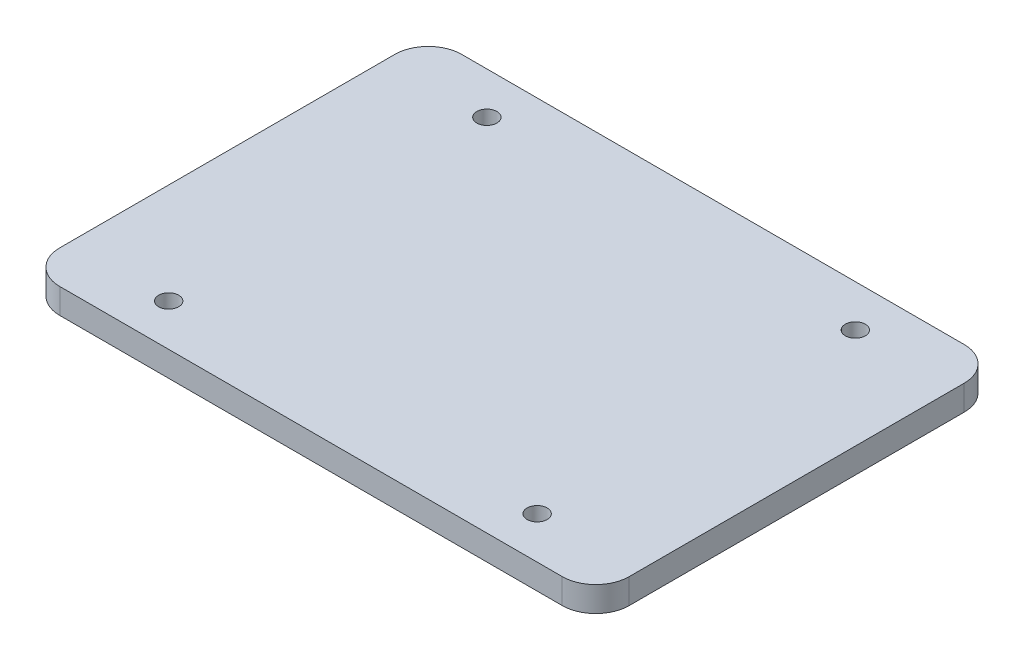
ISO-10303-21;
HEADER;
FILE_DESCRIPTION(('STEP AP214'),'2;1');
FILE_NAME('part.step','',(''),(''),'','','');
FILE_SCHEMA(('AUTOMOTIVE_DESIGN { 1 0 10303 214 1 1 1 1 }'));
ENDSEC;
DATA;
#1=APPLICATION_CONTEXT('core data for automotive mechanical design processes');
#2=APPLICATION_PROTOCOL_DEFINITION('international standard','automotive_design',2000,#1);
#3=PRODUCT_CONTEXT('',#1,'mechanical');
#4=PRODUCT('Part','Part','',(#3));
#5=PRODUCT_RELATED_PRODUCT_CATEGORY('part','',(#4));
#6=PRODUCT_DEFINITION_FORMATION('','',#4);
#7=PRODUCT_DEFINITION_CONTEXT('part definition',#1,'design');
#8=PRODUCT_DEFINITION('design','',#6,#7);
#9=PRODUCT_DEFINITION_SHAPE('','',#8);
#10=(LENGTH_UNIT() NAMED_UNIT(*) SI_UNIT(.MILLI.,.METRE.));
#11=(NAMED_UNIT(*) PLANE_ANGLE_UNIT() SI_UNIT($,.RADIAN.));
#12=(NAMED_UNIT(*) SI_UNIT($,.STERADIAN.) SOLID_ANGLE_UNIT());
#13=UNCERTAINTY_MEASURE_WITH_UNIT(LENGTH_MEASURE(1.E-05),#10,'distance_accuracy_value','');
#14=(GEOMETRIC_REPRESENTATION_CONTEXT(3) GLOBAL_UNCERTAINTY_ASSIGNED_CONTEXT((#13)) GLOBAL_UNIT_ASSIGNED_CONTEXT((#10,
#11,#12)) REPRESENTATION_CONTEXT('',''));
#15=CARTESIAN_POINT('',(0.,0.,0.));
#16=DIRECTION('',(0.,0.,1.));
#17=DIRECTION('',(1.,0.,0.));
#18=AXIS2_PLACEMENT_3D('',#15,#16,#17);
#19=CARTESIAN_POINT('',(-150.,15.,-100.));
#20=DIRECTION('',(0.,-1.,0.));
#21=DIRECTION('',(0.,0.,-1.));
#22=AXIS2_PLACEMENT_3D('',#19,#20,#21);
#23=CYLINDRICAL_SURFACE('',#22,20.);
#24=CARTESIAN_POINT('',(-150.,0.,-100.));
#25=DIRECTION('',(0.,-1.,0.));
#26=DIRECTION('',(0.,0.,-1.));
#27=AXIS2_PLACEMENT_3D('',#24,#25,#26);
#28=CIRCLE('',#27,20.);
#29=CARTESIAN_POINT('',(-170.,0.,-100.));
#30=VERTEX_POINT('',#29);
#31=CARTESIAN_POINT('',(-150.,0.,-120.));
#32=VERTEX_POINT('',#31);
#33=EDGE_CURVE('E142',#30,#32,#28,.T.);
#34=ORIENTED_EDGE('',*,*,#33,.F.);
#35=DIRECTION('',(0.,-1.,0.));
#36=VECTOR('',#35,1.);
#37=CARTESIAN_POINT('',(-170.,15.,-100.));
#38=LINE('',#37,#36);
#39=CARTESIAN_POINT('',(-170.,15.,-100.));
#40=VERTEX_POINT('',#39);
#41=EDGE_CURVE('E11',#40,#30,#38,.T.);
#42=ORIENTED_EDGE('',*,*,#41,.F.);
#43=CARTESIAN_POINT('',(-150.,15.,-100.));
#44=DIRECTION('',(0.,-1.,0.));
#45=DIRECTION('',(0.,0.,-1.));
#46=AXIS2_PLACEMENT_3D('',#43,#44,#45);
#47=CIRCLE('',#46,20.);
#48=CARTESIAN_POINT('',(-150.,15.,-120.));
#49=VERTEX_POINT('',#48);
#50=EDGE_CURVE('E162',#40,#49,#47,.T.);
#51=ORIENTED_EDGE('',*,*,#50,.T.);
#52=DIRECTION('',(0.,-1.,0.));
#53=VECTOR('',#52,1.);
#54=CARTESIAN_POINT('',(-150.,15.,-120.));
#55=LINE('',#54,#53);
#56=EDGE_CURVE('E50',#49,#32,#55,.T.);
#57=ORIENTED_EDGE('',*,*,#56,.T.);
#58=EDGE_LOOP('',(#34,#42,#51,#57));
#59=FACE_BOUND('',#58,.T.);
#60=ADVANCED_FACE('F47',(#59),#23,.T.);
#61=CARTESIAN_POINT('',(-170.,15.,-100.));
#62=DIRECTION('',(1.,0.,0.));
#63=DIRECTION('',(0.,0.,-1.));
#64=AXIS2_PLACEMENT_3D('',#61,#62,#63);
#65=PLANE('',#64);
#66=DIRECTION('',(0.,0.,1.));
#67=VECTOR('',#66,1.);
#68=CARTESIAN_POINT('',(-170.,0.,-100.));
#69=LINE('',#68,#67);
#70=CARTESIAN_POINT('',(-170.,0.,99.9999999999999));
#71=VERTEX_POINT('',#70);
#72=EDGE_CURVE('E161',#30,#71,#69,.T.);
#73=ORIENTED_EDGE('',*,*,#72,.T.);
#74=DIRECTION('',(0.,-1.,0.));
#75=VECTOR('',#74,1.);
#76=CARTESIAN_POINT('',(-170.,15.,99.9999999999999));
#77=LINE('',#76,#75);
#78=CARTESIAN_POINT('',(-170.,15.,99.9999999999999));
#79=VERTEX_POINT('',#78);
#80=EDGE_CURVE('E56',#79,#71,#77,.T.);
#81=ORIENTED_EDGE('',*,*,#80,.F.);
#82=DIRECTION('',(0.,0.,1.));
#83=VECTOR('',#82,1.);
#84=CARTESIAN_POINT('',(-170.,15.,-100.));
#85=LINE('',#84,#83);
#86=EDGE_CURVE('E137',#40,#79,#85,.T.);
#87=ORIENTED_EDGE('',*,*,#86,.F.);
#88=ORIENTED_EDGE('',*,*,#41,.T.);
#89=EDGE_LOOP('',(#73,#81,#87,#88));
#90=FACE_BOUND('',#89,.T.);
#91=ADVANCED_FACE('F175',(#90),#65,.F.);
#92=CARTESIAN_POINT('',(-150.,15.,100.));
#93=DIRECTION('',(0.,-1.,0.));
#94=DIRECTION('',(0.,0.,-1.));
#95=AXIS2_PLACEMENT_3D('',#92,#93,#94);
#96=CYLINDRICAL_SURFACE('',#95,20.);
#97=CARTESIAN_POINT('',(-150.,0.,100.));
#98=DIRECTION('',(0.,-1.,0.));
#99=DIRECTION('',(0.,0.,-1.));
#100=AXIS2_PLACEMENT_3D('',#97,#98,#99);
#101=CIRCLE('',#100,20.);
#102=CARTESIAN_POINT('',(-150.,0.,120.));
#103=VERTEX_POINT('',#102);
#104=EDGE_CURVE('E122',#103,#71,#101,.T.);
#105=ORIENTED_EDGE('',*,*,#104,.F.);
#106=DIRECTION('',(0.,-1.,0.));
#107=VECTOR('',#106,1.);
#108=CARTESIAN_POINT('',(-150.,15.,120.));
#109=LINE('',#108,#107);
#110=CARTESIAN_POINT('',(-150.,15.,120.));
#111=VERTEX_POINT('',#110);
#112=EDGE_CURVE('E116',#111,#103,#109,.T.);
#113=ORIENTED_EDGE('',*,*,#112,.F.);
#114=CARTESIAN_POINT('',(-150.,15.,100.));
#115=DIRECTION('',(0.,-1.,0.));
#116=DIRECTION('',(0.,0.,-1.));
#117=AXIS2_PLACEMENT_3D('',#114,#115,#116);
#118=CIRCLE('',#117,20.);
#119=EDGE_CURVE('E120',#111,#79,#118,.T.);
#120=ORIENTED_EDGE('',*,*,#119,.T.);
#121=ORIENTED_EDGE('',*,*,#80,.T.);
#122=EDGE_LOOP('',(#105,#113,#120,#121));
#123=FACE_BOUND('',#122,.T.);
#124=ADVANCED_FACE('F118',(#123),#96,.T.);
#125=CARTESIAN_POINT('',(-150.,15.,120.));
#126=DIRECTION('',(0.,0.,-1.));
#127=DIRECTION('',(-1.,0.,0.));
#128=AXIS2_PLACEMENT_3D('',#125,#126,#127);
#129=PLANE('',#128);
#130=DIRECTION('',(1.,0.,0.));
#131=VECTOR('',#130,1.);
#132=CARTESIAN_POINT('',(-150.,0.,120.));
#133=LINE('',#132,#131);
#134=CARTESIAN_POINT('',(150.,0.,120.));
#135=VERTEX_POINT('',#134);
#136=EDGE_CURVE('E158',#103,#135,#133,.T.);
#137=ORIENTED_EDGE('',*,*,#136,.T.);
#138=DIRECTION('',(0.,-1.,0.));
#139=VECTOR('',#138,1.);
#140=CARTESIAN_POINT('',(150.,15.,120.));
#141=LINE('',#140,#139);
#142=CARTESIAN_POINT('',(150.,15.,120.));
#143=VERTEX_POINT('',#142);
#144=EDGE_CURVE('E125',#143,#135,#141,.T.);
#145=ORIENTED_EDGE('',*,*,#144,.F.);
#146=DIRECTION('',(1.,0.,0.));
#147=VECTOR('',#146,1.);
#148=CARTESIAN_POINT('',(-150.,15.,120.));
#149=LINE('',#148,#147);
#150=EDGE_CURVE('E128',#111,#143,#149,.T.);
#151=ORIENTED_EDGE('',*,*,#150,.F.);
#152=ORIENTED_EDGE('',*,*,#112,.T.);
#153=EDGE_LOOP('',(#137,#145,#151,#152));
#154=FACE_BOUND('',#153,.T.);
#155=ADVANCED_FACE('F129',(#154),#129,.F.);
#156=CARTESIAN_POINT('',(150.,15.,100.));
#157=DIRECTION('',(0.,-1.,0.));
#158=DIRECTION('',(0.,0.,-1.));
#159=AXIS2_PLACEMENT_3D('',#156,#157,#158);
#160=CYLINDRICAL_SURFACE('',#159,20.);
#161=CARTESIAN_POINT('',(150.,0.,100.));
#162=DIRECTION('',(0.,1.,0.));
#163=DIRECTION('',(0.,0.,1.));
#164=AXIS2_PLACEMENT_3D('',#161,#162,#163);
#165=CIRCLE('',#164,20.);
#166=CARTESIAN_POINT('',(170.,0.,99.9999999999999));
#167=VERTEX_POINT('',#166);
#168=EDGE_CURVE('E155',#135,#167,#165,.T.);
#169=ORIENTED_EDGE('',*,*,#168,.T.);
#170=DIRECTION('',(0.,-1.,0.));
#171=VECTOR('',#170,1.);
#172=CARTESIAN_POINT('',(170.,15.,99.9999999999999));
#173=LINE('',#172,#171);
#174=CARTESIAN_POINT('',(170.,15.,99.9999999999999));
#175=VERTEX_POINT('',#174);
#176=EDGE_CURVE('E166',#175,#167,#173,.T.);
#177=ORIENTED_EDGE('',*,*,#176,.F.);
#178=CARTESIAN_POINT('',(150.,15.,100.));
#179=DIRECTION('',(0.,1.,0.));
#180=DIRECTION('',(0.,0.,1.));
#181=AXIS2_PLACEMENT_3D('',#178,#179,#180);
#182=CIRCLE('',#181,20.);
#183=EDGE_CURVE('E133',#143,#175,#182,.T.);
#184=ORIENTED_EDGE('',*,*,#183,.F.);
#185=ORIENTED_EDGE('',*,*,#144,.T.);
#186=EDGE_LOOP('',(#169,#177,#184,#185));
#187=FACE_BOUND('',#186,.T.);
#188=ADVANCED_FACE('F190',(#187),#160,.T.);
#189=CARTESIAN_POINT('',(170.,15.,-99.9999999999998));
#190=DIRECTION('',(1.,0.,0.));
#191=DIRECTION('',(0.,0.,-1.));
#192=AXIS2_PLACEMENT_3D('',#189,#190,#191);
#193=PLANE('',#192);
#194=DIRECTION('',(0.,0.,1.));
#195=VECTOR('',#194,1.);
#196=CARTESIAN_POINT('',(170.,0.,-99.9999999999998));
#197=LINE('',#196,#195);
#198=CARTESIAN_POINT('',(170.,0.,-99.9999999999998));
#199=VERTEX_POINT('',#198);
#200=EDGE_CURVE('E152',#199,#167,#197,.T.);
#201=ORIENTED_EDGE('',*,*,#200,.F.);
#202=DIRECTION('',(0.,-1.,0.));
#203=VECTOR('',#202,1.);
#204=CARTESIAN_POINT('',(170.,15.,-99.9999999999998));
#205=LINE('',#204,#203);
#206=CARTESIAN_POINT('',(170.,15.,-99.9999999999998));
#207=VERTEX_POINT('',#206);
#208=EDGE_CURVE('E168',#207,#199,#205,.T.);
#209=ORIENTED_EDGE('',*,*,#208,.F.);
#210=DIRECTION('',(0.,0.,1.));
#211=VECTOR('',#210,1.);
#212=CARTESIAN_POINT('',(170.,15.,-99.9999999999998));
#213=LINE('',#212,#211);
#214=EDGE_CURVE('E185',#207,#175,#213,.T.);
#215=ORIENTED_EDGE('',*,*,#214,.T.);
#216=ORIENTED_EDGE('',*,*,#176,.T.);
#217=EDGE_LOOP('',(#201,#209,#215,#216));
#218=FACE_BOUND('',#217,.T.);
#219=ADVANCED_FACE('F194',(#218),#193,.T.);
#220=CARTESIAN_POINT('',(150.,15.,-100.));
#221=DIRECTION('',(0.,-1.,0.));
#222=DIRECTION('',(0.,0.,-1.));
#223=AXIS2_PLACEMENT_3D('',#220,#221,#222);
#224=CYLINDRICAL_SURFACE('',#223,20.);
#225=CARTESIAN_POINT('',(150.,0.,-100.));
#226=DIRECTION('',(0.,1.,0.));
#227=DIRECTION('',(0.,0.,1.));
#228=AXIS2_PLACEMENT_3D('',#225,#226,#227);
#229=CIRCLE('',#228,20.);
#230=CARTESIAN_POINT('',(150.,0.,-120.));
#231=VERTEX_POINT('',#230);
#232=EDGE_CURVE('E149',#199,#231,#229,.T.);
#233=ORIENTED_EDGE('',*,*,#232,.T.);
#234=DIRECTION('',(0.,-1.,0.));
#235=VECTOR('',#234,1.);
#236=CARTESIAN_POINT('',(150.,15.,-120.));
#237=LINE('',#236,#235);
#238=CARTESIAN_POINT('',(150.,15.,-120.));
#239=VERTEX_POINT('',#238);
#240=EDGE_CURVE('E169',#239,#231,#237,.T.);
#241=ORIENTED_EDGE('',*,*,#240,.F.);
#242=CARTESIAN_POINT('',(150.,15.,-100.));
#243=DIRECTION('',(0.,1.,0.));
#244=DIRECTION('',(0.,0.,1.));
#245=AXIS2_PLACEMENT_3D('',#242,#243,#244);
#246=CIRCLE('',#245,20.);
#247=EDGE_CURVE('E178',#207,#239,#246,.T.);
#248=ORIENTED_EDGE('',*,*,#247,.F.);
#249=ORIENTED_EDGE('',*,*,#208,.T.);
#250=EDGE_LOOP('',(#233,#241,#248,#249));
#251=FACE_BOUND('',#250,.T.);
#252=ADVANCED_FACE('F197',(#251),#224,.T.);
#253=CARTESIAN_POINT('',(-150.,15.,-120.));
#254=DIRECTION('',(0.,0.,-1.));
#255=DIRECTION('',(-1.,0.,0.));
#256=AXIS2_PLACEMENT_3D('',#253,#254,#255);
#257=PLANE('',#256);
#258=DIRECTION('',(1.,0.,0.));
#259=VECTOR('',#258,1.);
#260=CARTESIAN_POINT('',(-150.,0.,-120.));
#261=LINE('',#260,#259);
#262=EDGE_CURVE('E145',#32,#231,#261,.T.);
#263=ORIENTED_EDGE('',*,*,#262,.F.);
#264=ORIENTED_EDGE('',*,*,#56,.F.);
#265=DIRECTION('',(1.,0.,0.));
#266=VECTOR('',#265,1.);
#267=CARTESIAN_POINT('',(-150.,15.,-120.));
#268=LINE('',#267,#266);
#269=EDGE_CURVE('E176',#49,#239,#268,.T.);
#270=ORIENTED_EDGE('',*,*,#269,.T.);
#271=ORIENTED_EDGE('',*,*,#240,.T.);
#272=EDGE_LOOP('',(#263,#264,#270,#271));
#273=FACE_BOUND('',#272,.T.);
#274=ADVANCED_FACE('F171',(#273),#257,.T.);
#275=CARTESIAN_POINT('',(-150.,15.,-100.));
#276=DIRECTION('',(0.,-1.,0.));
#277=DIRECTION('',(0.,0.,-1.));
#278=AXIS2_PLACEMENT_3D('',#275,#276,#277);
#279=PLANE('',#278);
#280=CARTESIAN_POINT('',(110.,15.,-95.0000000000001));
#281=DIRECTION('',(0.,-1.,0.));
#282=DIRECTION('',(0.,0.,-1.));
#283=AXIS2_PLACEMENT_3D('',#280,#281,#282);
#284=CIRCLE('',#283,6.);
#285=CARTESIAN_POINT('',(110.,15.,-101.));
#286=VERTEX_POINT('',#285);
#287=EDGE_CURVE('E352',#286,#286,#284,.T.);
#288=ORIENTED_EDGE('',*,*,#287,.T.);
#289=EDGE_LOOP('',(#288));
#290=FACE_BOUND('',#289,.T.);
#291=CARTESIAN_POINT('',(-110.,15.,-95.));
#292=DIRECTION('',(0.,1.,0.));
#293=DIRECTION('',(0.,0.,1.));
#294=AXIS2_PLACEMENT_3D('',#291,#292,#293);
#295=CIRCLE('',#294,6.);
#296=CARTESIAN_POINT('',(-110.,15.,-89.));
#297=VERTEX_POINT('',#296);
#298=EDGE_CURVE('E360',#297,#297,#295,.T.);
#299=ORIENTED_EDGE('',*,*,#298,.F.);
#300=EDGE_LOOP('',(#299));
#301=FACE_BOUND('',#300,.T.);
#302=CARTESIAN_POINT('',(110.,15.,94.9999999999997));
#303=DIRECTION('',(0.,1.,0.));
#304=DIRECTION('',(0.,0.,1.));
#305=AXIS2_PLACEMENT_3D('',#302,#303,#304);
#306=CIRCLE('',#305,6.00000000000001);
#307=CARTESIAN_POINT('',(110.,15.,88.9999999999997));
#308=VERTEX_POINT('',#307);
#309=EDGE_CURVE('E366',#308,#308,#306,.T.);
#310=ORIENTED_EDGE('',*,*,#309,.F.);
#311=EDGE_LOOP('',(#310));
#312=FACE_BOUND('',#311,.T.);
#313=CARTESIAN_POINT('',(-110.,15.,94.9999999999998));
#314=DIRECTION('',(0.,-1.,0.));
#315=DIRECTION('',(0.,0.,-1.));
#316=AXIS2_PLACEMENT_3D('',#313,#314,#315);
#317=CIRCLE('',#316,6.00000000000001);
#318=CARTESIAN_POINT('',(-110.,15.,88.9999999999998));
#319=VERTEX_POINT('',#318);
#320=EDGE_CURVE('E146',#319,#319,#317,.T.);
#321=ORIENTED_EDGE('',*,*,#320,.T.);
#322=EDGE_LOOP('',(#321));
#323=FACE_BOUND('',#322,.T.);
#324=ORIENTED_EDGE('',*,*,#50,.F.);
#325=ORIENTED_EDGE('',*,*,#86,.T.);
#326=ORIENTED_EDGE('',*,*,#119,.F.);
#327=ORIENTED_EDGE('',*,*,#150,.T.);
#328=ORIENTED_EDGE('',*,*,#183,.T.);
#329=ORIENTED_EDGE('',*,*,#214,.F.);
#330=ORIENTED_EDGE('',*,*,#247,.T.);
#331=ORIENTED_EDGE('',*,*,#269,.F.);
#332=EDGE_LOOP('',(#324,#325,#326,#327,#328,#329,#330,#331));
#333=FACE_BOUND('',#332,.T.);
#334=ADVANCED_FACE('F136',(#290,#301,#312,#323,#333),#279,.F.);
#335=CARTESIAN_POINT('',(-150.,0.,-100.));
#336=DIRECTION('',(0.,-1.,0.));
#337=DIRECTION('',(0.,0.,-1.));
#338=AXIS2_PLACEMENT_3D('',#335,#336,#337);
#339=PLANE('',#338);
#340=CARTESIAN_POINT('',(110.,0.,-95.0000000000001));
#341=DIRECTION('',(0.,-1.,0.));
#342=DIRECTION('',(0.,0.,-1.));
#343=AXIS2_PLACEMENT_3D('',#340,#341,#342);
#344=CIRCLE('',#343,6.);
#345=CARTESIAN_POINT('',(110.,0.,-101.));
#346=VERTEX_POINT('',#345);
#347=EDGE_CURVE('E355',#346,#346,#344,.T.);
#348=ORIENTED_EDGE('',*,*,#347,.F.);
#349=EDGE_LOOP('',(#348));
#350=FACE_BOUND('',#349,.T.);
#351=CARTESIAN_POINT('',(-110.,0.,-95.));
#352=DIRECTION('',(0.,1.,0.));
#353=DIRECTION('',(0.,0.,1.));
#354=AXIS2_PLACEMENT_3D('',#351,#352,#353);
#355=CIRCLE('',#354,6.);
#356=CARTESIAN_POINT('',(-110.,0.,-89.));
#357=VERTEX_POINT('',#356);
#358=EDGE_CURVE('E357',#357,#357,#355,.T.);
#359=ORIENTED_EDGE('',*,*,#358,.T.);
#360=EDGE_LOOP('',(#359));
#361=FACE_BOUND('',#360,.T.);
#362=CARTESIAN_POINT('',(110.,0.,94.9999999999997));
#363=DIRECTION('',(0.,1.,0.));
#364=DIRECTION('',(0.,0.,1.));
#365=AXIS2_PLACEMENT_3D('',#362,#363,#364);
#366=CIRCLE('',#365,6.00000000000001);
#367=CARTESIAN_POINT('',(110.,0.,88.9999999999997));
#368=VERTEX_POINT('',#367);
#369=EDGE_CURVE('E363',#368,#368,#366,.T.);
#370=ORIENTED_EDGE('',*,*,#369,.T.);
#371=EDGE_LOOP('',(#370));
#372=FACE_BOUND('',#371,.T.);
#373=CARTESIAN_POINT('',(-110.,0.,94.9999999999998));
#374=DIRECTION('',(0.,-1.,0.));
#375=DIRECTION('',(0.,0.,-1.));
#376=AXIS2_PLACEMENT_3D('',#373,#374,#375);
#377=CIRCLE('',#376,6.00000000000001);
#378=CARTESIAN_POINT('',(-110.,0.,88.9999999999998));
#379=VERTEX_POINT('',#378);
#380=EDGE_CURVE('E181',#379,#379,#377,.T.);
#381=ORIENTED_EDGE('',*,*,#380,.F.);
#382=EDGE_LOOP('',(#381));
#383=FACE_BOUND('',#382,.T.);
#384=ORIENTED_EDGE('',*,*,#33,.T.);
#385=ORIENTED_EDGE('',*,*,#262,.T.);
#386=ORIENTED_EDGE('',*,*,#232,.F.);
#387=ORIENTED_EDGE('',*,*,#200,.T.);
#388=ORIENTED_EDGE('',*,*,#168,.F.);
#389=ORIENTED_EDGE('',*,*,#136,.F.);
#390=ORIENTED_EDGE('',*,*,#104,.T.);
#391=ORIENTED_EDGE('',*,*,#72,.F.);
#392=EDGE_LOOP('',(#384,#385,#386,#387,#388,#389,#390,#391));
#393=FACE_BOUND('',#392,.T.);
#394=ADVANCED_FACE('F174',(#350,#361,#372,#383,#393),#339,.T.);
#395=CARTESIAN_POINT('',(-110.,15.,94.9999999999998));
#396=DIRECTION('',(0.,-1.,0.));
#397=DIRECTION('',(0.,0.,-1.));
#398=AXIS2_PLACEMENT_3D('',#395,#396,#397);
#399=CYLINDRICAL_SURFACE('',#398,6.00000000000001);
#400=ORIENTED_EDGE('',*,*,#320,.F.);
#401=EDGE_LOOP('',(#400));
#402=FACE_BOUND('',#401,.T.);
#403=ORIENTED_EDGE('',*,*,#380,.T.);
#404=EDGE_LOOP('',(#403));
#405=FACE_BOUND('',#404,.T.);
#406=ADVANCED_FACE('F309',(#402,#405),#399,.F.);
#407=CARTESIAN_POINT('',(110.,15.,94.9999999999997));
#408=DIRECTION('',(0.,-1.,0.));
#409=DIRECTION('',(0.,0.,-1.));
#410=AXIS2_PLACEMENT_3D('',#407,#408,#409);
#411=CYLINDRICAL_SURFACE('',#410,6.00000000000001);
#412=CARTESIAN_POINT('',(110.,15.,88.9999999999997));
#413=CARTESIAN_POINT('',(110.,14.84375,88.9999999999997));
#414=CARTESIAN_POINT('',(110.,14.6875,88.9999999999997));
#415=CARTESIAN_POINT('',(110.,14.375,88.9999999999997));
#416=CARTESIAN_POINT('',(110.,14.21875,88.9999999999997));
#417=CARTESIAN_POINT('',(110.,13.90625,88.9999999999997));
#418=CARTESIAN_POINT('',(110.,13.75,88.9999999999997));
#419=CARTESIAN_POINT('',(110.,13.4375,88.9999999999997));
#420=CARTESIAN_POINT('',(110.,13.28125,88.9999999999997));
#421=CARTESIAN_POINT('',(110.,12.96875,88.9999999999997));
#422=CARTESIAN_POINT('',(110.,12.8125,88.9999999999997));
#423=CARTESIAN_POINT('',(110.,12.5,88.9999999999997));
#424=CARTESIAN_POINT('',(110.,12.34375,88.9999999999997));
#425=CARTESIAN_POINT('',(110.,12.03125,88.9999999999997));
#426=CARTESIAN_POINT('',(110.,11.875,88.9999999999997));
#427=CARTESIAN_POINT('',(110.,11.5625,88.9999999999997));
#428=CARTESIAN_POINT('',(110.,11.40625,88.9999999999997));
#429=CARTESIAN_POINT('',(110.,11.09375,88.9999999999997));
#430=CARTESIAN_POINT('',(110.,10.9375,88.9999999999997));
#431=CARTESIAN_POINT('',(110.,10.625,88.9999999999997));
#432=CARTESIAN_POINT('',(110.,10.46875,88.9999999999997));
#433=CARTESIAN_POINT('',(110.,10.15625,88.9999999999997));
#434=CARTESIAN_POINT('',(110.,9.99999999999998,88.9999999999997));
#435=CARTESIAN_POINT('',(110.,9.68749999999998,88.9999999999997));
#436=CARTESIAN_POINT('',(110.,9.53124999999999,88.9999999999997));
#437=CARTESIAN_POINT('',(110.,9.21874999999999,88.9999999999997));
#438=CARTESIAN_POINT('',(110.,9.06249999999999,88.9999999999997));
#439=CARTESIAN_POINT('',(110.,8.74999999999999,88.9999999999997));
#440=CARTESIAN_POINT('',(110.,8.59374999999999,88.9999999999997));
#441=CARTESIAN_POINT('',(110.,8.28124999999999,88.9999999999997));
#442=CARTESIAN_POINT('',(110.,8.12499999999999,88.9999999999997));
#443=CARTESIAN_POINT('',(110.,7.81249999999999,88.9999999999997));
#444=CARTESIAN_POINT('',(110.,7.65624999999999,88.9999999999997));
#445=CARTESIAN_POINT('',(110.,7.34374999999999,88.9999999999997));
#446=CARTESIAN_POINT('',(110.,7.18749999999999,88.9999999999997));
#447=CARTESIAN_POINT('',(110.,6.87499999999999,88.9999999999997));
#448=CARTESIAN_POINT('',(110.,6.71874999999999,88.9999999999997));
#449=CARTESIAN_POINT('',(110.,6.40624999999999,88.9999999999997));
#450=CARTESIAN_POINT('',(110.,6.24999999999999,88.9999999999997));
#451=CARTESIAN_POINT('',(110.,5.93749999999999,88.9999999999997));
#452=CARTESIAN_POINT('',(110.,5.78124999999999,88.9999999999997));
#453=CARTESIAN_POINT('',(110.,5.46874999999999,88.9999999999997));
#454=CARTESIAN_POINT('',(110.,5.31249999999999,88.9999999999997));
#455=CARTESIAN_POINT('',(110.,4.99999999999999,88.9999999999997));
#456=CARTESIAN_POINT('',(110.,4.84374999999999,88.9999999999997));
#457=CARTESIAN_POINT('',(110.,4.53124999999999,88.9999999999997));
#458=CARTESIAN_POINT('',(110.,4.37499999999999,88.9999999999997));
#459=CARTESIAN_POINT('',(110.,4.06249999999999,88.9999999999997));
#460=CARTESIAN_POINT('',(110.,3.90624999999999,88.9999999999997));
#461=CARTESIAN_POINT('',(110.,3.59374999999999,88.9999999999997));
#462=CARTESIAN_POINT('',(110.,3.43749999999999,88.9999999999997));
#463=CARTESIAN_POINT('',(110.,3.12499999999999,88.9999999999997));
#464=CARTESIAN_POINT('',(110.,2.96875,88.9999999999997));
#465=CARTESIAN_POINT('',(110.,2.65625,88.9999999999997));
#466=CARTESIAN_POINT('',(110.,2.5,88.9999999999997));
#467=CARTESIAN_POINT('',(110.,2.1875,88.9999999999997));
#468=CARTESIAN_POINT('',(110.,2.03125,88.9999999999997));
#469=CARTESIAN_POINT('',(110.,1.71875,88.9999999999997));
#470=CARTESIAN_POINT('',(110.,1.5625,88.9999999999997));
#471=CARTESIAN_POINT('',(110.,1.25,88.9999999999997));
#472=CARTESIAN_POINT('',(110.,1.09375,88.9999999999997));
#473=CARTESIAN_POINT('',(110.,0.781249999999997,88.9999999999997));
#474=CARTESIAN_POINT('',(110.,0.624999999999997,88.9999999999997));
#475=CARTESIAN_POINT('',(110.,0.312499999999997,88.9999999999997));
#476=CARTESIAN_POINT('',(110.,0.156249999999998,88.9999999999997));
#477=CARTESIAN_POINT('',(110.,0.,88.9999999999997));
#478=B_SPLINE_CURVE_WITH_KNOTS('',3,(#412,#413,#414,#415,#416,#417,#418,#419,#420,#421,#422,
#423,#424,#425,#426,#427,#428,#429,#430,#431,#432,#433,#434,#435,#436,#437,#438,#439,#440,#441,
#442,#443,#444,#445,#446,#447,#448,#449,#450,#451,#452,#453,#454,#455,#456,#457,#458,#459,#460,
#461,#462,#463,#464,#465,#466,#467,#468,#469,#470,#471,#472,#473,#474,#475,#476,#477),
.UNSPECIFIED.,.F.,.F.,(4,2,2,2,2,2,2,2,2,2,2,2,2,2,2,2,2,2,2,2,2,2,2,2,2,2,2,2,2,2,2,2,4),(0.,
0.46875,0.937499999999999,1.40625,1.875,2.34375,2.8125,3.28125,3.75,4.21874999999999,
4.68749999999999,5.15624999999999,5.62499999999999,6.09374999999999,6.56249999999999,
7.03124999999999,7.49999999999999,7.96874999999999,8.43749999999999,8.90624999999999,
9.37499999999999,9.84374999999999,10.3125,10.78125,11.25,11.71875,12.1875,12.65625,13.125,
13.59375,14.0625,14.53125,15.),.UNSPECIFIED.);
#479=EDGE_CURVE('BSEAM318',#308,#368,#478,.T.);
#480=ORIENTED_EDGE('',*,*,#309,.T.);
#481=ORIENTED_EDGE('',*,*,#369,.F.);
#482=ORIENTED_EDGE('',*,*,#479,.T.);
#483=ORIENTED_EDGE('',*,*,#479,.F.);
#484=EDGE_LOOP('',(#480,#482,#481,#483));
#485=FACE_BOUND('',#484,.T.);
#486=ADVANCED_FACE('F318',(#485),#411,.F.);
#487=CARTESIAN_POINT('',(-110.,15.,-95.));
#488=DIRECTION('',(0.,-1.,0.));
#489=DIRECTION('',(0.,0.,-1.));
#490=AXIS2_PLACEMENT_3D('',#487,#488,#489);
#491=CYLINDRICAL_SURFACE('',#490,6.);
#492=ORIENTED_EDGE('',*,*,#298,.T.);
#493=EDGE_LOOP('',(#492));
#494=FACE_BOUND('',#493,.T.);
#495=ORIENTED_EDGE('',*,*,#358,.F.);
#496=EDGE_LOOP('',(#495));
#497=FACE_BOUND('',#496,.T.);
#498=ADVANCED_FACE('F328',(#494,#497),#491,.F.);
#499=CARTESIAN_POINT('',(110.,15.,-95.0000000000001));
#500=DIRECTION('',(0.,-1.,0.));
#501=DIRECTION('',(0.,0.,-1.));
#502=AXIS2_PLACEMENT_3D('',#499,#500,#501);
#503=CYLINDRICAL_SURFACE('',#502,6.);
#504=ORIENTED_EDGE('',*,*,#287,.F.);
#505=EDGE_LOOP('',(#504));
#506=FACE_BOUND('',#505,.T.);
#507=ORIENTED_EDGE('',*,*,#347,.T.);
#508=EDGE_LOOP('',(#507));
#509=FACE_BOUND('',#508,.T.);
#510=ADVANCED_FACE('F337',(#506,#509),#503,.F.);
#511=CLOSED_SHELL('',(#60,#91,#124,#155,#188,#219,#252,#274,#334,#394,#406,#486,#498,#510));
#512=MANIFOLD_SOLID_BREP('B2',#511);
#513=ADVANCED_BREP_SHAPE_REPRESENTATION('',(#18,#512),#14);
#514=SHAPE_DEFINITION_REPRESENTATION(#9,#513);
ENDSEC;
END-ISO-10303-21;
